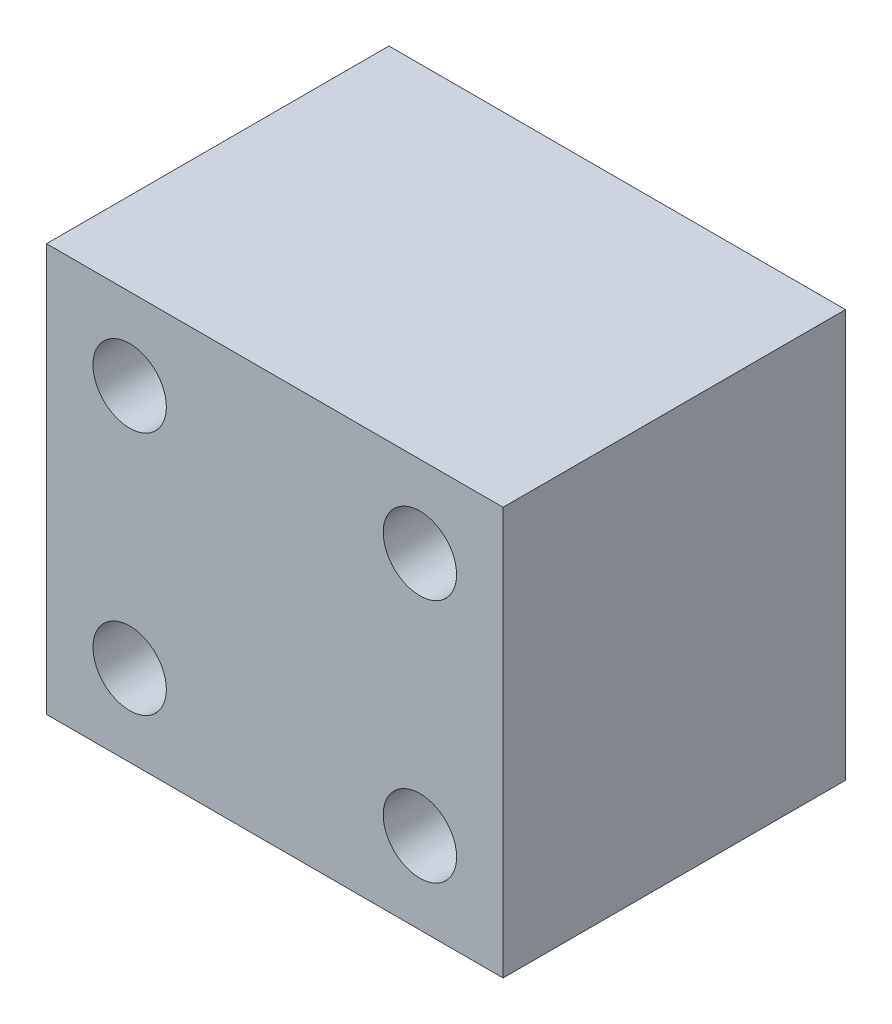
ISO-10303-21;
HEADER;
FILE_DESCRIPTION(('STEP AP214'),'2;1');
FILE_NAME('part.step','',(''),(''),'','','');
FILE_SCHEMA(('AUTOMOTIVE_DESIGN { 1 0 10303 214 1 1 1 1 }'));
ENDSEC;
DATA;
#1=APPLICATION_CONTEXT('core data for automotive mechanical design processes');
#2=APPLICATION_PROTOCOL_DEFINITION('international standard','automotive_design',2000,#1);
#3=PRODUCT_CONTEXT('',#1,'mechanical');
#4=PRODUCT('Part','Part','',(#3));
#5=PRODUCT_RELATED_PRODUCT_CATEGORY('part','',(#4));
#6=PRODUCT_DEFINITION_FORMATION('','',#4);
#7=PRODUCT_DEFINITION_CONTEXT('part definition',#1,'design');
#8=PRODUCT_DEFINITION('design','',#6,#7);
#9=PRODUCT_DEFINITION_SHAPE('','',#8);
#10=(LENGTH_UNIT() NAMED_UNIT(*) SI_UNIT(.MILLI.,.METRE.));
#11=(NAMED_UNIT(*) PLANE_ANGLE_UNIT() SI_UNIT($,.RADIAN.));
#12=(NAMED_UNIT(*) SI_UNIT($,.STERADIAN.) SOLID_ANGLE_UNIT());
#13=UNCERTAINTY_MEASURE_WITH_UNIT(LENGTH_MEASURE(1.E-05),#10,'distance_accuracy_value','');
#14=(GEOMETRIC_REPRESENTATION_CONTEXT(3) GLOBAL_UNCERTAINTY_ASSIGNED_CONTEXT((#13)) GLOBAL_UNIT_ASSIGNED_CONTEXT((#10,
#11,#12)) REPRESENTATION_CONTEXT('',''));
#15=CARTESIAN_POINT('',(0.,0.,0.));
#16=DIRECTION('',(0.,0.,1.));
#17=DIRECTION('',(1.,0.,0.));
#18=AXIS2_PLACEMENT_3D('',#15,#16,#17);
#19=CARTESIAN_POINT('',(14.,12.5,21.));
#20=DIRECTION('',(-1.,0.,0.));
#21=DIRECTION('',(0.,0.,1.));
#22=AXIS2_PLACEMENT_3D('',#19,#20,#21);
#23=PLANE('',#22);
#24=DIRECTION('',(0.,1.,0.));
#25=VECTOR('',#24,1.);
#26=CARTESIAN_POINT('',(14.,12.5,0.));
#27=LINE('',#26,#25);
#28=CARTESIAN_POINT('',(14.,-12.5,0.));
#29=VERTEX_POINT('',#28);
#30=CARTESIAN_POINT('',(14.,12.5,0.));
#31=VERTEX_POINT('',#30);
#32=EDGE_CURVE('E106',#29,#31,#27,.T.);
#33=ORIENTED_EDGE('',*,*,#32,.T.);
#34=DIRECTION('',(0.,0.,-1.));
#35=VECTOR('',#34,1.);
#36=CARTESIAN_POINT('',(14.,12.5,21.));
#37=LINE('',#36,#35);
#38=CARTESIAN_POINT('',(14.,12.5,21.));
#39=VERTEX_POINT('',#38);
#40=EDGE_CURVE('E11',#39,#31,#37,.T.);
#41=ORIENTED_EDGE('',*,*,#40,.F.);
#42=DIRECTION('',(0.,1.,0.));
#43=VECTOR('',#42,1.);
#44=CARTESIAN_POINT('',(14.,12.5,21.));
#45=LINE('',#44,#43);
#46=CARTESIAN_POINT('',(14.,-12.5,21.));
#47=VERTEX_POINT('',#46);
#48=EDGE_CURVE('E90',#47,#39,#45,.T.);
#49=ORIENTED_EDGE('',*,*,#48,.F.);
#50=DIRECTION('',(0.,0.,-1.));
#51=VECTOR('',#50,1.);
#52=CARTESIAN_POINT('',(14.,-12.5,21.));
#53=LINE('',#52,#51);
#54=EDGE_CURVE('E102',#47,#29,#53,.T.);
#55=ORIENTED_EDGE('',*,*,#54,.T.);
#56=EDGE_LOOP('',(#33,#41,#49,#55));
#57=FACE_BOUND('',#56,.T.);
#58=ADVANCED_FACE('F38',(#57),#23,.F.);
#59=CARTESIAN_POINT('',(-14.,12.5,21.));
#60=DIRECTION('',(0.,-1.,0.));
#61=DIRECTION('',(0.,0.,-1.));
#62=AXIS2_PLACEMENT_3D('',#59,#60,#61);
#63=PLANE('',#62);
#64=DIRECTION('',(-1.,0.,0.));
#65=VECTOR('',#64,1.);
#66=CARTESIAN_POINT('',(-14.,12.5,0.));
#67=LINE('',#66,#65);
#68=CARTESIAN_POINT('',(-14.,12.5,0.));
#69=VERTEX_POINT('',#68);
#70=EDGE_CURVE('E95',#31,#69,#67,.T.);
#71=ORIENTED_EDGE('',*,*,#70,.T.);
#72=DIRECTION('',(0.,0.,-1.));
#73=VECTOR('',#72,1.);
#74=CARTESIAN_POINT('',(-14.,12.5,21.));
#75=LINE('',#74,#73);
#76=CARTESIAN_POINT('',(-14.,12.5,21.));
#77=VERTEX_POINT('',#76);
#78=EDGE_CURVE('E47',#77,#69,#75,.T.);
#79=ORIENTED_EDGE('',*,*,#78,.F.);
#80=DIRECTION('',(-1.,0.,0.));
#81=VECTOR('',#80,1.);
#82=CARTESIAN_POINT('',(-14.,12.5,21.));
#83=LINE('',#82,#81);
#84=EDGE_CURVE('E85',#39,#77,#83,.T.);
#85=ORIENTED_EDGE('',*,*,#84,.F.);
#86=ORIENTED_EDGE('',*,*,#40,.T.);
#87=EDGE_LOOP('',(#71,#79,#85,#86));
#88=FACE_BOUND('',#87,.T.);
#89=ADVANCED_FACE('F94',(#88),#63,.F.);
#90=CARTESIAN_POINT('',(-14.,12.5,21.));
#91=DIRECTION('',(1.,0.,0.));
#92=DIRECTION('',(0.,0.,-1.));
#93=AXIS2_PLACEMENT_3D('',#90,#91,#92);
#94=PLANE('',#93);
#95=DIRECTION('',(0.,-1.,0.));
#96=VECTOR('',#95,1.);
#97=CARTESIAN_POINT('',(-14.,12.5,0.));
#98=LINE('',#97,#96);
#99=CARTESIAN_POINT('',(-14.,-12.5,0.));
#100=VERTEX_POINT('',#99);
#101=EDGE_CURVE('E72',#69,#100,#98,.T.);
#102=ORIENTED_EDGE('',*,*,#101,.T.);
#103=DIRECTION('',(0.,0.,-1.));
#104=VECTOR('',#103,1.);
#105=CARTESIAN_POINT('',(-14.,-12.5,21.));
#106=LINE('',#105,#104);
#107=CARTESIAN_POINT('',(-14.,-12.5,21.));
#108=VERTEX_POINT('',#107);
#109=EDGE_CURVE('E97',#108,#100,#106,.T.);
#110=ORIENTED_EDGE('',*,*,#109,.F.);
#111=DIRECTION('',(0.,-1.,0.));
#112=VECTOR('',#111,1.);
#113=CARTESIAN_POINT('',(-14.,12.5,21.));
#114=LINE('',#113,#112);
#115=EDGE_CURVE('E88',#77,#108,#114,.T.);
#116=ORIENTED_EDGE('',*,*,#115,.F.);
#117=ORIENTED_EDGE('',*,*,#78,.T.);
#118=EDGE_LOOP('',(#102,#110,#116,#117));
#119=FACE_BOUND('',#118,.T.);
#120=ADVANCED_FACE('F98',(#119),#94,.F.);
#121=CARTESIAN_POINT('',(-14.,-12.5,21.));
#122=DIRECTION('',(0.,1.,0.));
#123=DIRECTION('',(0.,0.,1.));
#124=AXIS2_PLACEMENT_3D('',#121,#122,#123);
#125=PLANE('',#124);
#126=DIRECTION('',(1.,0.,0.));
#127=VECTOR('',#126,1.);
#128=CARTESIAN_POINT('',(-14.,-12.5,0.));
#129=LINE('',#128,#127);
#130=EDGE_CURVE('E78',#100,#29,#129,.T.);
#131=ORIENTED_EDGE('',*,*,#130,.T.);
#132=ORIENTED_EDGE('',*,*,#54,.F.);
#133=DIRECTION('',(1.,0.,0.));
#134=VECTOR('',#133,1.);
#135=CARTESIAN_POINT('',(-14.,-12.5,21.));
#136=LINE('',#135,#134);
#137=EDGE_CURVE('E55',#108,#47,#136,.T.);
#138=ORIENTED_EDGE('',*,*,#137,.F.);
#139=ORIENTED_EDGE('',*,*,#109,.T.);
#140=EDGE_LOOP('',(#131,#132,#138,#139));
#141=FACE_BOUND('',#140,.T.);
#142=ADVANCED_FACE('F120',(#141),#125,.F.);
#143=CARTESIAN_POINT('',(0.,0.,21.));
#144=DIRECTION('',(0.,0.,1.));
#145=DIRECTION('',(1.,0.,0.));
#146=AXIS2_PLACEMENT_3D('',#143,#144,#145);
#147=PLANE('',#146);
#148=CARTESIAN_POINT('',(-8.9,7.5,21.));
#149=DIRECTION('',(0.,0.,1.));
#150=DIRECTION('',(1.,0.,0.));
#151=AXIS2_PLACEMENT_3D('',#148,#149,#150);
#152=CIRCLE('',#151,2.25);
#153=CARTESIAN_POINT('',(-6.65,7.5,21.));
#154=VERTEX_POINT('',#153);
#155=EDGE_CURVE('E135',#154,#154,#152,.T.);
#156=ORIENTED_EDGE('',*,*,#155,.F.);
#157=EDGE_LOOP('',(#156));
#158=FACE_BOUND('',#157,.T.);
#159=CARTESIAN_POINT('',(8.9,7.5,21.));
#160=DIRECTION('',(0.,0.,1.));
#161=DIRECTION('',(1.,0.,0.));
#162=AXIS2_PLACEMENT_3D('',#159,#160,#161);
#163=CIRCLE('',#162,2.25);
#164=CARTESIAN_POINT('',(11.15,7.5,21.));
#165=VERTEX_POINT('',#164);
#166=EDGE_CURVE('E143',#165,#165,#163,.T.);
#167=ORIENTED_EDGE('',*,*,#166,.F.);
#168=EDGE_LOOP('',(#167));
#169=FACE_BOUND('',#168,.T.);
#170=CARTESIAN_POINT('',(8.9,-7.5,21.));
#171=DIRECTION('',(0.,0.,1.));
#172=DIRECTION('',(1.,0.,0.));
#173=AXIS2_PLACEMENT_3D('',#170,#171,#172);
#174=CIRCLE('',#173,2.25);
#175=CARTESIAN_POINT('',(11.15,-7.5,21.));
#176=VERTEX_POINT('',#175);
#177=EDGE_CURVE('E151',#176,#176,#174,.T.);
#178=ORIENTED_EDGE('',*,*,#177,.F.);
#179=EDGE_LOOP('',(#178));
#180=FACE_BOUND('',#179,.T.);
#181=CARTESIAN_POINT('',(-8.9,-7.5,21.));
#182=DIRECTION('',(0.,0.,1.));
#183=DIRECTION('',(1.,0.,0.));
#184=AXIS2_PLACEMENT_3D('',#181,#182,#183);
#185=CIRCLE('',#184,2.25);
#186=CARTESIAN_POINT('',(-6.65,-7.5,21.));
#187=VERTEX_POINT('',#186);
#188=EDGE_CURVE('E127',#187,#187,#185,.T.);
#189=ORIENTED_EDGE('',*,*,#188,.F.);
#190=EDGE_LOOP('',(#189));
#191=FACE_BOUND('',#190,.T.);
#192=ORIENTED_EDGE('',*,*,#48,.T.);
#193=ORIENTED_EDGE('',*,*,#84,.T.);
#194=ORIENTED_EDGE('',*,*,#115,.T.);
#195=ORIENTED_EDGE('',*,*,#137,.T.);
#196=EDGE_LOOP('',(#192,#193,#194,#195));
#197=FACE_BOUND('',#196,.T.);
#198=ADVANCED_FACE('F86',(#158,#169,#180,#191,#197),#147,.T.);
#199=CARTESIAN_POINT('',(0.,0.,0.));
#200=DIRECTION('',(0.,0.,1.));
#201=DIRECTION('',(1.,0.,0.));
#202=AXIS2_PLACEMENT_3D('',#199,#200,#201);
#203=PLANE('',#202);
#204=CARTESIAN_POINT('',(-8.9,7.5,0.));
#205=DIRECTION('',(0.,0.,1.));
#206=DIRECTION('',(1.,0.,0.));
#207=AXIS2_PLACEMENT_3D('',#204,#205,#206);
#208=CIRCLE('',#207,2.25);
#209=CARTESIAN_POINT('',(-6.65,7.5,0.));
#210=VERTEX_POINT('',#209);
#211=EDGE_CURVE('E139',#210,#210,#208,.T.);
#212=ORIENTED_EDGE('',*,*,#211,.T.);
#213=EDGE_LOOP('',(#212));
#214=FACE_BOUND('',#213,.T.);
#215=CARTESIAN_POINT('',(8.9,7.5,0.));
#216=DIRECTION('',(0.,0.,1.));
#217=DIRECTION('',(1.,0.,0.));
#218=AXIS2_PLACEMENT_3D('',#215,#216,#217);
#219=CIRCLE('',#218,2.25);
#220=CARTESIAN_POINT('',(11.15,7.5,0.));
#221=VERTEX_POINT('',#220);
#222=EDGE_CURVE('E147',#221,#221,#219,.T.);
#223=ORIENTED_EDGE('',*,*,#222,.T.);
#224=EDGE_LOOP('',(#223));
#225=FACE_BOUND('',#224,.T.);
#226=CARTESIAN_POINT('',(8.9,-7.5,0.));
#227=DIRECTION('',(0.,0.,1.));
#228=DIRECTION('',(1.,0.,0.));
#229=AXIS2_PLACEMENT_3D('',#226,#227,#228);
#230=CIRCLE('',#229,2.25);
#231=CARTESIAN_POINT('',(11.15,-7.5,0.));
#232=VERTEX_POINT('',#231);
#233=EDGE_CURVE('E131',#232,#232,#230,.T.);
#234=ORIENTED_EDGE('',*,*,#233,.T.);
#235=EDGE_LOOP('',(#234));
#236=FACE_BOUND('',#235,.T.);
#237=CARTESIAN_POINT('',(-8.9,-7.5,0.));
#238=DIRECTION('',(0.,0.,1.));
#239=DIRECTION('',(1.,0.,0.));
#240=AXIS2_PLACEMENT_3D('',#237,#238,#239);
#241=CIRCLE('',#240,2.25);
#242=CARTESIAN_POINT('',(-6.65,-7.5,0.));
#243=VERTEX_POINT('',#242);
#244=EDGE_CURVE('E110',#243,#243,#241,.T.);
#245=ORIENTED_EDGE('',*,*,#244,.T.);
#246=EDGE_LOOP('',(#245));
#247=FACE_BOUND('',#246,.T.);
#248=ORIENTED_EDGE('',*,*,#32,.F.);
#249=ORIENTED_EDGE('',*,*,#130,.F.);
#250=ORIENTED_EDGE('',*,*,#101,.F.);
#251=ORIENTED_EDGE('',*,*,#70,.F.);
#252=EDGE_LOOP('',(#248,#249,#250,#251));
#253=FACE_BOUND('',#252,.T.);
#254=ADVANCED_FACE('F123',(#214,#225,#236,#247,#253),#203,.F.);
#255=CARTESIAN_POINT('',(-8.9,-7.5,0.));
#256=DIRECTION('',(0.,0.,1.));
#257=DIRECTION('',(1.,0.,0.));
#258=AXIS2_PLACEMENT_3D('',#255,#256,#257);
#259=CYLINDRICAL_SURFACE('',#258,2.25);
#260=CARTESIAN_POINT('',(-6.65,-7.5,0.));
#261=CARTESIAN_POINT('',(-6.65,-7.5,0.21875));
#262=CARTESIAN_POINT('',(-6.65,-7.5,0.4375));
#263=CARTESIAN_POINT('',(-6.65,-7.5,0.875));
#264=CARTESIAN_POINT('',(-6.65,-7.5,1.09375));
#265=CARTESIAN_POINT('',(-6.65,-7.5,1.53125));
#266=CARTESIAN_POINT('',(-6.65,-7.5,1.75));
#267=CARTESIAN_POINT('',(-6.65,-7.5,2.1875));
#268=CARTESIAN_POINT('',(-6.65,-7.5,2.40625));
#269=CARTESIAN_POINT('',(-6.65,-7.5,2.84375));
#270=CARTESIAN_POINT('',(-6.65,-7.5,3.0625));
#271=CARTESIAN_POINT('',(-6.65,-7.5,3.5));
#272=CARTESIAN_POINT('',(-6.65,-7.5,3.71875));
#273=CARTESIAN_POINT('',(-6.65,-7.5,4.15625));
#274=CARTESIAN_POINT('',(-6.65,-7.5,4.375));
#275=CARTESIAN_POINT('',(-6.65,-7.5,4.8125));
#276=CARTESIAN_POINT('',(-6.65,-7.5,5.03125));
#277=CARTESIAN_POINT('',(-6.65,-7.5,5.46875));
#278=CARTESIAN_POINT('',(-6.65,-7.5,5.6875));
#279=CARTESIAN_POINT('',(-6.65,-7.5,6.125));
#280=CARTESIAN_POINT('',(-6.65,-7.5,6.34375));
#281=CARTESIAN_POINT('',(-6.65,-7.5,6.78125));
#282=CARTESIAN_POINT('',(-6.65,-7.5,7.));
#283=CARTESIAN_POINT('',(-6.65,-7.5,7.4375));
#284=CARTESIAN_POINT('',(-6.65,-7.5,7.65625));
#285=CARTESIAN_POINT('',(-6.65,-7.5,8.09375));
#286=CARTESIAN_POINT('',(-6.65,-7.5,8.3125));
#287=CARTESIAN_POINT('',(-6.65,-7.5,8.75));
#288=CARTESIAN_POINT('',(-6.65,-7.5,8.96875));
#289=CARTESIAN_POINT('',(-6.65,-7.5,9.40625));
#290=CARTESIAN_POINT('',(-6.65,-7.5,9.625));
#291=CARTESIAN_POINT('',(-6.65,-7.5,10.0625));
#292=CARTESIAN_POINT('',(-6.65,-7.5,10.28125));
#293=CARTESIAN_POINT('',(-6.65,-7.5,10.71875));
#294=CARTESIAN_POINT('',(-6.65,-7.5,10.9375));
#295=CARTESIAN_POINT('',(-6.65,-7.5,11.375));
#296=CARTESIAN_POINT('',(-6.65,-7.5,11.59375));
#297=CARTESIAN_POINT('',(-6.65,-7.5,12.03125));
#298=CARTESIAN_POINT('',(-6.65,-7.5,12.25));
#299=CARTESIAN_POINT('',(-6.65,-7.5,12.6875));
#300=CARTESIAN_POINT('',(-6.65,-7.5,12.90625));
#301=CARTESIAN_POINT('',(-6.65,-7.5,13.34375));
#302=CARTESIAN_POINT('',(-6.65,-7.5,13.5625));
#303=CARTESIAN_POINT('',(-6.65,-7.5,14.));
#304=CARTESIAN_POINT('',(-6.65,-7.5,14.21875));
#305=CARTESIAN_POINT('',(-6.65,-7.5,14.65625));
#306=CARTESIAN_POINT('',(-6.65,-7.5,14.875));
#307=CARTESIAN_POINT('',(-6.65,-7.5,15.3125));
#308=CARTESIAN_POINT('',(-6.65,-7.5,15.53125));
#309=CARTESIAN_POINT('',(-6.65,-7.5,15.96875));
#310=CARTESIAN_POINT('',(-6.65,-7.5,16.1875));
#311=CARTESIAN_POINT('',(-6.65,-7.5,16.625));
#312=CARTESIAN_POINT('',(-6.65,-7.5,16.84375));
#313=CARTESIAN_POINT('',(-6.65,-7.5,17.28125));
#314=CARTESIAN_POINT('',(-6.65,-7.5,17.5));
#315=CARTESIAN_POINT('',(-6.65,-7.5,17.9375));
#316=CARTESIAN_POINT('',(-6.65,-7.5,18.15625));
#317=CARTESIAN_POINT('',(-6.65,-7.5,18.59375));
#318=CARTESIAN_POINT('',(-6.65,-7.5,18.8125));
#319=CARTESIAN_POINT('',(-6.65,-7.5,19.25));
#320=CARTESIAN_POINT('',(-6.65,-7.5,19.46875));
#321=CARTESIAN_POINT('',(-6.65,-7.5,19.90625));
#322=CARTESIAN_POINT('',(-6.65,-7.5,20.125));
#323=CARTESIAN_POINT('',(-6.65,-7.5,20.5625));
#324=CARTESIAN_POINT('',(-6.65,-7.5,20.78125));
#325=CARTESIAN_POINT('',(-6.65,-7.5,21.));
#326=B_SPLINE_CURVE_WITH_KNOTS('',3,(#260,#261,#262,#263,#264,#265,#266,#267,#268,#269,#270,
#271,#272,#273,#274,#275,#276,#277,#278,#279,#280,#281,#282,#283,#284,#285,#286,#287,#288,#289,
#290,#291,#292,#293,#294,#295,#296,#297,#298,#299,#300,#301,#302,#303,#304,#305,#306,#307,#308,
#309,#310,#311,#312,#313,#314,#315,#316,#317,#318,#319,#320,#321,#322,#323,#324,#325),
.UNSPECIFIED.,.F.,.F.,(4,2,2,2,2,2,2,2,2,2,2,2,2,2,2,2,2,2,2,2,2,2,2,2,2,2,2,2,2,2,2,2,4),(0.,
0.65625,1.3125,1.96875,2.625,3.28125,3.9375,4.59375,5.25,5.90625,6.5625,7.21875,7.875,8.53125,
9.1875,9.84375,10.5,11.15625,11.8125,12.46875,13.125,13.78125,14.4375,15.09375,15.75,16.40625,
17.0625,17.71875,18.375,19.03125,19.6875,20.34375,21.),.UNSPECIFIED.);
#327=EDGE_CURVE('BSEAM165',#243,#187,#326,.T.);
#328=ORIENTED_EDGE('',*,*,#244,.F.);
#329=ORIENTED_EDGE('',*,*,#188,.T.);
#330=ORIENTED_EDGE('',*,*,#327,.T.);
#331=ORIENTED_EDGE('',*,*,#327,.F.);
#332=EDGE_LOOP('',(#328,#330,#329,#331));
#333=FACE_BOUND('',#332,.T.);
#334=ADVANCED_FACE('F165',(#333),#259,.F.);
#335=CARTESIAN_POINT('',(8.9,-7.5,0.));
#336=DIRECTION('',(0.,0.,1.));
#337=DIRECTION('',(1.,0.,0.));
#338=AXIS2_PLACEMENT_3D('',#335,#336,#337);
#339=CYLINDRICAL_SURFACE('',#338,2.25);
#340=CARTESIAN_POINT('',(11.15,-7.5,0.));
#341=CARTESIAN_POINT('',(11.15,-7.5,0.21875));
#342=CARTESIAN_POINT('',(11.15,-7.5,0.4375));
#343=CARTESIAN_POINT('',(11.15,-7.5,0.875));
#344=CARTESIAN_POINT('',(11.15,-7.5,1.09375));
#345=CARTESIAN_POINT('',(11.15,-7.5,1.53125));
#346=CARTESIAN_POINT('',(11.15,-7.5,1.75));
#347=CARTESIAN_POINT('',(11.15,-7.5,2.1875));
#348=CARTESIAN_POINT('',(11.15,-7.5,2.40625));
#349=CARTESIAN_POINT('',(11.15,-7.5,2.84375));
#350=CARTESIAN_POINT('',(11.15,-7.5,3.0625));
#351=CARTESIAN_POINT('',(11.15,-7.5,3.5));
#352=CARTESIAN_POINT('',(11.15,-7.5,3.71875));
#353=CARTESIAN_POINT('',(11.15,-7.5,4.15625));
#354=CARTESIAN_POINT('',(11.15,-7.5,4.375));
#355=CARTESIAN_POINT('',(11.15,-7.5,4.8125));
#356=CARTESIAN_POINT('',(11.15,-7.5,5.03125));
#357=CARTESIAN_POINT('',(11.15,-7.5,5.46875));
#358=CARTESIAN_POINT('',(11.15,-7.5,5.6875));
#359=CARTESIAN_POINT('',(11.15,-7.5,6.125));
#360=CARTESIAN_POINT('',(11.15,-7.5,6.34375));
#361=CARTESIAN_POINT('',(11.15,-7.5,6.78125));
#362=CARTESIAN_POINT('',(11.15,-7.5,7.));
#363=CARTESIAN_POINT('',(11.15,-7.5,7.4375));
#364=CARTESIAN_POINT('',(11.15,-7.5,7.65625));
#365=CARTESIAN_POINT('',(11.15,-7.5,8.09375));
#366=CARTESIAN_POINT('',(11.15,-7.5,8.3125));
#367=CARTESIAN_POINT('',(11.15,-7.5,8.75));
#368=CARTESIAN_POINT('',(11.15,-7.5,8.96875));
#369=CARTESIAN_POINT('',(11.15,-7.5,9.40625));
#370=CARTESIAN_POINT('',(11.15,-7.5,9.625));
#371=CARTESIAN_POINT('',(11.15,-7.5,10.0625));
#372=CARTESIAN_POINT('',(11.15,-7.5,10.28125));
#373=CARTESIAN_POINT('',(11.15,-7.5,10.71875));
#374=CARTESIAN_POINT('',(11.15,-7.5,10.9375));
#375=CARTESIAN_POINT('',(11.15,-7.5,11.375));
#376=CARTESIAN_POINT('',(11.15,-7.5,11.59375));
#377=CARTESIAN_POINT('',(11.15,-7.5,12.03125));
#378=CARTESIAN_POINT('',(11.15,-7.5,12.25));
#379=CARTESIAN_POINT('',(11.15,-7.5,12.6875));
#380=CARTESIAN_POINT('',(11.15,-7.5,12.90625));
#381=CARTESIAN_POINT('',(11.15,-7.5,13.34375));
#382=CARTESIAN_POINT('',(11.15,-7.5,13.5625));
#383=CARTESIAN_POINT('',(11.15,-7.5,14.));
#384=CARTESIAN_POINT('',(11.15,-7.5,14.21875));
#385=CARTESIAN_POINT('',(11.15,-7.5,14.65625));
#386=CARTESIAN_POINT('',(11.15,-7.5,14.875));
#387=CARTESIAN_POINT('',(11.15,-7.5,15.3125));
#388=CARTESIAN_POINT('',(11.15,-7.5,15.53125));
#389=CARTESIAN_POINT('',(11.15,-7.5,15.96875));
#390=CARTESIAN_POINT('',(11.15,-7.5,16.1875));
#391=CARTESIAN_POINT('',(11.15,-7.5,16.625));
#392=CARTESIAN_POINT('',(11.15,-7.5,16.84375));
#393=CARTESIAN_POINT('',(11.15,-7.5,17.28125));
#394=CARTESIAN_POINT('',(11.15,-7.5,17.5));
#395=CARTESIAN_POINT('',(11.15,-7.5,17.9375));
#396=CARTESIAN_POINT('',(11.15,-7.5,18.15625));
#397=CARTESIAN_POINT('',(11.15,-7.5,18.59375));
#398=CARTESIAN_POINT('',(11.15,-7.5,18.8125));
#399=CARTESIAN_POINT('',(11.15,-7.5,19.25));
#400=CARTESIAN_POINT('',(11.15,-7.5,19.46875));
#401=CARTESIAN_POINT('',(11.15,-7.5,19.90625));
#402=CARTESIAN_POINT('',(11.15,-7.5,20.125));
#403=CARTESIAN_POINT('',(11.15,-7.5,20.5625));
#404=CARTESIAN_POINT('',(11.15,-7.5,20.78125));
#405=CARTESIAN_POINT('',(11.15,-7.5,21.));
#406=B_SPLINE_CURVE_WITH_KNOTS('',3,(#340,#341,#342,#343,#344,#345,#346,#347,#348,#349,#350,
#351,#352,#353,#354,#355,#356,#357,#358,#359,#360,#361,#362,#363,#364,#365,#366,#367,#368,#369,
#370,#371,#372,#373,#374,#375,#376,#377,#378,#379,#380,#381,#382,#383,#384,#385,#386,#387,#388,
#389,#390,#391,#392,#393,#394,#395,#396,#397,#398,#399,#400,#401,#402,#403,#404,#405),
.UNSPECIFIED.,.F.,.F.,(4,2,2,2,2,2,2,2,2,2,2,2,2,2,2,2,2,2,2,2,2,2,2,2,2,2,2,2,2,2,2,2,4),(0.,
0.65625,1.3125,1.96875,2.625,3.28125,3.9375,4.59375,5.25,5.90625,6.5625,7.21875,7.875,8.53125,
9.1875,9.84375,10.5,11.15625,11.8125,12.46875,13.125,13.78125,14.4375,15.09375,15.75,16.40625,
17.0625,17.71875,18.375,19.03125,19.6875,20.34375,21.),.UNSPECIFIED.);
#407=EDGE_CURVE('BSEAM161',#232,#176,#406,.T.);
#408=ORIENTED_EDGE('',*,*,#233,.F.);
#409=ORIENTED_EDGE('',*,*,#177,.T.);
#410=ORIENTED_EDGE('',*,*,#407,.T.);
#411=ORIENTED_EDGE('',*,*,#407,.F.);
#412=EDGE_LOOP('',(#408,#410,#409,#411));
#413=FACE_BOUND('',#412,.T.);
#414=ADVANCED_FACE('F161',(#413),#339,.F.);
#415=CARTESIAN_POINT('',(8.9,7.5,0.));
#416=DIRECTION('',(0.,0.,1.));
#417=DIRECTION('',(1.,0.,0.));
#418=AXIS2_PLACEMENT_3D('',#415,#416,#417);
#419=CYLINDRICAL_SURFACE('',#418,2.25);
#420=CARTESIAN_POINT('',(11.15,7.5,0.));
#421=CARTESIAN_POINT('',(11.15,7.5,0.21875));
#422=CARTESIAN_POINT('',(11.15,7.5,0.4375));
#423=CARTESIAN_POINT('',(11.15,7.5,0.875));
#424=CARTESIAN_POINT('',(11.15,7.5,1.09375));
#425=CARTESIAN_POINT('',(11.15,7.5,1.53125));
#426=CARTESIAN_POINT('',(11.15,7.5,1.75));
#427=CARTESIAN_POINT('',(11.15,7.5,2.1875));
#428=CARTESIAN_POINT('',(11.15,7.5,2.40625));
#429=CARTESIAN_POINT('',(11.15,7.5,2.84375));
#430=CARTESIAN_POINT('',(11.15,7.5,3.0625));
#431=CARTESIAN_POINT('',(11.15,7.5,3.5));
#432=CARTESIAN_POINT('',(11.15,7.5,3.71875));
#433=CARTESIAN_POINT('',(11.15,7.5,4.15625));
#434=CARTESIAN_POINT('',(11.15,7.5,4.375));
#435=CARTESIAN_POINT('',(11.15,7.5,4.8125));
#436=CARTESIAN_POINT('',(11.15,7.5,5.03125));
#437=CARTESIAN_POINT('',(11.15,7.5,5.46875));
#438=CARTESIAN_POINT('',(11.15,7.5,5.6875));
#439=CARTESIAN_POINT('',(11.15,7.5,6.125));
#440=CARTESIAN_POINT('',(11.15,7.5,6.34375));
#441=CARTESIAN_POINT('',(11.15,7.5,6.78125));
#442=CARTESIAN_POINT('',(11.15,7.5,7.));
#443=CARTESIAN_POINT('',(11.15,7.5,7.4375));
#444=CARTESIAN_POINT('',(11.15,7.5,7.65625));
#445=CARTESIAN_POINT('',(11.15,7.5,8.09375));
#446=CARTESIAN_POINT('',(11.15,7.5,8.3125));
#447=CARTESIAN_POINT('',(11.15,7.5,8.75));
#448=CARTESIAN_POINT('',(11.15,7.5,8.96875));
#449=CARTESIAN_POINT('',(11.15,7.5,9.40625));
#450=CARTESIAN_POINT('',(11.15,7.5,9.625));
#451=CARTESIAN_POINT('',(11.15,7.5,10.0625));
#452=CARTESIAN_POINT('',(11.15,7.5,10.28125));
#453=CARTESIAN_POINT('',(11.15,7.5,10.71875));
#454=CARTESIAN_POINT('',(11.15,7.5,10.9375));
#455=CARTESIAN_POINT('',(11.15,7.5,11.375));
#456=CARTESIAN_POINT('',(11.15,7.5,11.59375));
#457=CARTESIAN_POINT('',(11.15,7.5,12.03125));
#458=CARTESIAN_POINT('',(11.15,7.5,12.25));
#459=CARTESIAN_POINT('',(11.15,7.5,12.6875));
#460=CARTESIAN_POINT('',(11.15,7.5,12.90625));
#461=CARTESIAN_POINT('',(11.15,7.5,13.34375));
#462=CARTESIAN_POINT('',(11.15,7.5,13.5625));
#463=CARTESIAN_POINT('',(11.15,7.5,14.));
#464=CARTESIAN_POINT('',(11.15,7.5,14.21875));
#465=CARTESIAN_POINT('',(11.15,7.5,14.65625));
#466=CARTESIAN_POINT('',(11.15,7.5,14.875));
#467=CARTESIAN_POINT('',(11.15,7.5,15.3125));
#468=CARTESIAN_POINT('',(11.15,7.5,15.53125));
#469=CARTESIAN_POINT('',(11.15,7.5,15.96875));
#470=CARTESIAN_POINT('',(11.15,7.5,16.1875));
#471=CARTESIAN_POINT('',(11.15,7.5,16.625));
#472=CARTESIAN_POINT('',(11.15,7.5,16.84375));
#473=CARTESIAN_POINT('',(11.15,7.5,17.28125));
#474=CARTESIAN_POINT('',(11.15,7.5,17.5));
#475=CARTESIAN_POINT('',(11.15,7.5,17.9375));
#476=CARTESIAN_POINT('',(11.15,7.5,18.15625));
#477=CARTESIAN_POINT('',(11.15,7.5,18.59375));
#478=CARTESIAN_POINT('',(11.15,7.5,18.8125));
#479=CARTESIAN_POINT('',(11.15,7.5,19.25));
#480=CARTESIAN_POINT('',(11.15,7.5,19.46875));
#481=CARTESIAN_POINT('',(11.15,7.5,19.90625));
#482=CARTESIAN_POINT('',(11.15,7.5,20.125));
#483=CARTESIAN_POINT('',(11.15,7.5,20.5625));
#484=CARTESIAN_POINT('',(11.15,7.5,20.78125));
#485=CARTESIAN_POINT('',(11.15,7.5,21.));
#486=B_SPLINE_CURVE_WITH_KNOTS('',3,(#420,#421,#422,#423,#424,#425,#426,#427,#428,#429,#430,
#431,#432,#433,#434,#435,#436,#437,#438,#439,#440,#441,#442,#443,#444,#445,#446,#447,#448,#449,
#450,#451,#452,#453,#454,#455,#456,#457,#458,#459,#460,#461,#462,#463,#464,#465,#466,#467,#468,
#469,#470,#471,#472,#473,#474,#475,#476,#477,#478,#479,#480,#481,#482,#483,#484,#485),
.UNSPECIFIED.,.F.,.F.,(4,2,2,2,2,2,2,2,2,2,2,2,2,2,2,2,2,2,2,2,2,2,2,2,2,2,2,2,2,2,2,2,4),(0.,
0.65625,1.3125,1.96875,2.625,3.28125,3.9375,4.59375,5.25,5.90625,6.5625,7.21875,7.875,8.53125,
9.1875,9.84375,10.5,11.15625,11.8125,12.46875,13.125,13.78125,14.4375,15.09375,15.75,16.40625,
17.0625,17.71875,18.375,19.03125,19.6875,20.34375,21.),.UNSPECIFIED.);
#487=EDGE_CURVE('BSEAM164',#221,#165,#486,.T.);
#488=ORIENTED_EDGE('',*,*,#222,.F.);
#489=ORIENTED_EDGE('',*,*,#166,.T.);
#490=ORIENTED_EDGE('',*,*,#487,.T.);
#491=ORIENTED_EDGE('',*,*,#487,.F.);
#492=EDGE_LOOP('',(#488,#490,#489,#491));
#493=FACE_BOUND('',#492,.T.);
#494=ADVANCED_FACE('F164',(#493),#419,.F.);
#495=CARTESIAN_POINT('',(-8.9,7.5,0.));
#496=DIRECTION('',(0.,0.,1.));
#497=DIRECTION('',(1.,0.,0.));
#498=AXIS2_PLACEMENT_3D('',#495,#496,#497);
#499=CYLINDRICAL_SURFACE('',#498,2.25);
#500=CARTESIAN_POINT('',(-6.65,7.5,0.));
#501=CARTESIAN_POINT('',(-6.65,7.5,0.21875));
#502=CARTESIAN_POINT('',(-6.65,7.5,0.4375));
#503=CARTESIAN_POINT('',(-6.65,7.5,0.875));
#504=CARTESIAN_POINT('',(-6.65,7.5,1.09375));
#505=CARTESIAN_POINT('',(-6.65,7.5,1.53125));
#506=CARTESIAN_POINT('',(-6.65,7.5,1.75));
#507=CARTESIAN_POINT('',(-6.65,7.5,2.1875));
#508=CARTESIAN_POINT('',(-6.65,7.5,2.40625));
#509=CARTESIAN_POINT('',(-6.65,7.5,2.84375));
#510=CARTESIAN_POINT('',(-6.65,7.5,3.0625));
#511=CARTESIAN_POINT('',(-6.65,7.5,3.5));
#512=CARTESIAN_POINT('',(-6.65,7.5,3.71875));
#513=CARTESIAN_POINT('',(-6.65,7.5,4.15625));
#514=CARTESIAN_POINT('',(-6.65,7.5,4.375));
#515=CARTESIAN_POINT('',(-6.65,7.5,4.8125));
#516=CARTESIAN_POINT('',(-6.65,7.5,5.03125));
#517=CARTESIAN_POINT('',(-6.65,7.5,5.46875));
#518=CARTESIAN_POINT('',(-6.65,7.5,5.6875));
#519=CARTESIAN_POINT('',(-6.65,7.5,6.125));
#520=CARTESIAN_POINT('',(-6.65,7.5,6.34375));
#521=CARTESIAN_POINT('',(-6.65,7.5,6.78125));
#522=CARTESIAN_POINT('',(-6.65,7.5,7.));
#523=CARTESIAN_POINT('',(-6.65,7.5,7.4375));
#524=CARTESIAN_POINT('',(-6.65,7.5,7.65625));
#525=CARTESIAN_POINT('',(-6.65,7.5,8.09375));
#526=CARTESIAN_POINT('',(-6.65,7.5,8.3125));
#527=CARTESIAN_POINT('',(-6.65,7.5,8.75));
#528=CARTESIAN_POINT('',(-6.65,7.5,8.96875));
#529=CARTESIAN_POINT('',(-6.65,7.5,9.40625));
#530=CARTESIAN_POINT('',(-6.65,7.5,9.625));
#531=CARTESIAN_POINT('',(-6.65,7.5,10.0625));
#532=CARTESIAN_POINT('',(-6.65,7.5,10.28125));
#533=CARTESIAN_POINT('',(-6.65,7.5,10.71875));
#534=CARTESIAN_POINT('',(-6.65,7.5,10.9375));
#535=CARTESIAN_POINT('',(-6.65,7.5,11.375));
#536=CARTESIAN_POINT('',(-6.65,7.5,11.59375));
#537=CARTESIAN_POINT('',(-6.65,7.5,12.03125));
#538=CARTESIAN_POINT('',(-6.65,7.5,12.25));
#539=CARTESIAN_POINT('',(-6.65,7.5,12.6875));
#540=CARTESIAN_POINT('',(-6.65,7.5,12.90625));
#541=CARTESIAN_POINT('',(-6.65,7.5,13.34375));
#542=CARTESIAN_POINT('',(-6.65,7.5,13.5625));
#543=CARTESIAN_POINT('',(-6.65,7.5,14.));
#544=CARTESIAN_POINT('',(-6.65,7.5,14.21875));
#545=CARTESIAN_POINT('',(-6.65,7.5,14.65625));
#546=CARTESIAN_POINT('',(-6.65,7.5,14.875));
#547=CARTESIAN_POINT('',(-6.65,7.5,15.3125));
#548=CARTESIAN_POINT('',(-6.65,7.5,15.53125));
#549=CARTESIAN_POINT('',(-6.65,7.5,15.96875));
#550=CARTESIAN_POINT('',(-6.65,7.5,16.1875));
#551=CARTESIAN_POINT('',(-6.65,7.5,16.625));
#552=CARTESIAN_POINT('',(-6.65,7.5,16.84375));
#553=CARTESIAN_POINT('',(-6.65,7.5,17.28125));
#554=CARTESIAN_POINT('',(-6.65,7.5,17.5));
#555=CARTESIAN_POINT('',(-6.65,7.5,17.9375));
#556=CARTESIAN_POINT('',(-6.65,7.5,18.15625));
#557=CARTESIAN_POINT('',(-6.65,7.5,18.59375));
#558=CARTESIAN_POINT('',(-6.65,7.5,18.8125));
#559=CARTESIAN_POINT('',(-6.65,7.5,19.25));
#560=CARTESIAN_POINT('',(-6.65,7.5,19.46875));
#561=CARTESIAN_POINT('',(-6.65,7.5,19.90625));
#562=CARTESIAN_POINT('',(-6.65,7.5,20.125));
#563=CARTESIAN_POINT('',(-6.65,7.5,20.5625));
#564=CARTESIAN_POINT('',(-6.65,7.5,20.78125));
#565=CARTESIAN_POINT('',(-6.65,7.5,21.));
#566=B_SPLINE_CURVE_WITH_KNOTS('',3,(#500,#501,#502,#503,#504,#505,#506,#507,#508,#509,#510,
#511,#512,#513,#514,#515,#516,#517,#518,#519,#520,#521,#522,#523,#524,#525,#526,#527,#528,#529,
#530,#531,#532,#533,#534,#535,#536,#537,#538,#539,#540,#541,#542,#543,#544,#545,#546,#547,#548,
#549,#550,#551,#552,#553,#554,#555,#556,#557,#558,#559,#560,#561,#562,#563,#564,#565),
.UNSPECIFIED.,.F.,.F.,(4,2,2,2,2,2,2,2,2,2,2,2,2,2,2,2,2,2,2,2,2,2,2,2,2,2,2,2,2,2,2,2,4),(0.,
0.65625,1.3125,1.96875,2.625,3.28125,3.9375,4.59375,5.25,5.90625,6.5625,7.21875,7.875,8.53125,
9.1875,9.84375,10.5,11.15625,11.8125,12.46875,13.125,13.78125,14.4375,15.09375,15.75,16.40625,
17.0625,17.71875,18.375,19.03125,19.6875,20.34375,21.),.UNSPECIFIED.);
#567=EDGE_CURVE('BSEAM228',#210,#154,#566,.T.);
#568=ORIENTED_EDGE('',*,*,#211,.F.);
#569=ORIENTED_EDGE('',*,*,#155,.T.);
#570=ORIENTED_EDGE('',*,*,#567,.T.);
#571=ORIENTED_EDGE('',*,*,#567,.F.);
#572=EDGE_LOOP('',(#568,#570,#569,#571));
#573=FACE_BOUND('',#572,.T.);
#574=ADVANCED_FACE('F228',(#573),#499,.F.);
#575=CLOSED_SHELL('',(#58,#89,#120,#142,#198,#254,#334,#414,#494,#574));
#576=MANIFOLD_SOLID_BREP('B2',#575);
#577=ADVANCED_BREP_SHAPE_REPRESENTATION('',(#18,#576),#14);
#578=SHAPE_DEFINITION_REPRESENTATION(#9,#577);
ENDSEC;
END-ISO-10303-21;
